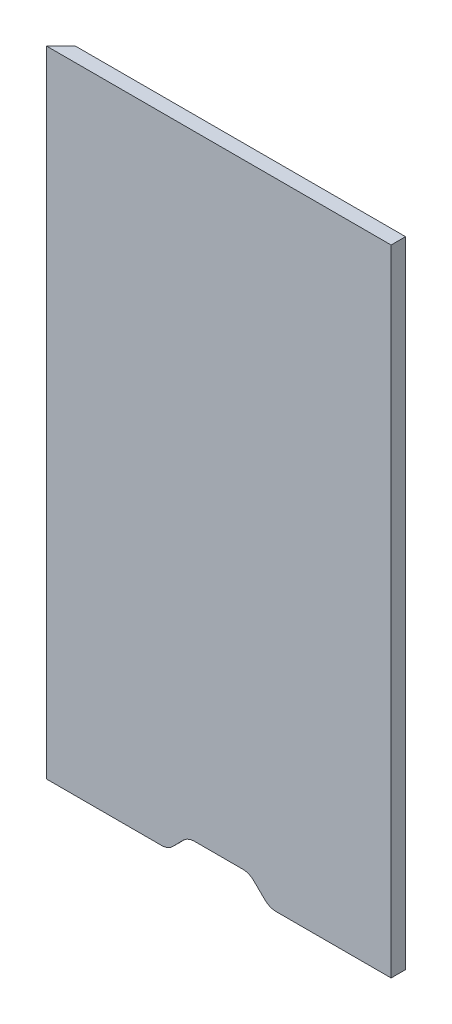
ISO-10303-21;
HEADER;
FILE_DESCRIPTION(('STEP AP214'),'2;1');
FILE_NAME('part.step','',(''),(''),'','','');
FILE_SCHEMA(('AUTOMOTIVE_DESIGN { 1 0 10303 214 1 1 1 1 }'));
ENDSEC;
DATA;
#1=APPLICATION_CONTEXT('core data for automotive mechanical design processes');
#2=APPLICATION_PROTOCOL_DEFINITION('international standard','automotive_design',2000,#1);
#3=PRODUCT_CONTEXT('',#1,'mechanical');
#4=PRODUCT('Part','Part','',(#3));
#5=PRODUCT_RELATED_PRODUCT_CATEGORY('part','',(#4));
#6=PRODUCT_DEFINITION_FORMATION('','',#4);
#7=PRODUCT_DEFINITION_CONTEXT('part definition',#1,'design');
#8=PRODUCT_DEFINITION('design','',#6,#7);
#9=PRODUCT_DEFINITION_SHAPE('','',#8);
#10=(LENGTH_UNIT() NAMED_UNIT(*) SI_UNIT(.MILLI.,.METRE.));
#11=(NAMED_UNIT(*) PLANE_ANGLE_UNIT() SI_UNIT($,.RADIAN.));
#12=(NAMED_UNIT(*) SI_UNIT($,.STERADIAN.) SOLID_ANGLE_UNIT());
#13=UNCERTAINTY_MEASURE_WITH_UNIT(LENGTH_MEASURE(1.E-05),#10,'distance_accuracy_value','');
#14=(GEOMETRIC_REPRESENTATION_CONTEXT(3) GLOBAL_UNCERTAINTY_ASSIGNED_CONTEXT((#13)) GLOBAL_UNIT_ASSIGNED_CONTEXT((#10,
#11,#12)) REPRESENTATION_CONTEXT('',''));
#15=CARTESIAN_POINT('',(0.,0.,0.));
#16=DIRECTION('',(0.,0.,1.));
#17=DIRECTION('',(1.,0.,0.));
#18=AXIS2_PLACEMENT_3D('',#15,#16,#17);
#19=CARTESIAN_POINT('',(0.,0.,18.));
#20=DIRECTION('',(0.707106781186547,0.,0.707106781186548));
#21=DIRECTION('',(0.,-1.,0.));
#22=AXIS2_PLACEMENT_3D('',#19,#20,#21);
#23=PLANE('',#22);
#24=DIRECTION('',(0.,-1.,0.));
#25=VECTOR('',#24,1.);
#26=CARTESIAN_POINT('',(0.,0.,18.));
#27=LINE('',#26,#25);
#28=CARTESIAN_POINT('',(0.,792.,18.));
#29=VERTEX_POINT('',#28);
#30=CARTESIAN_POINT('',(0.,0.,18.));
#31=VERTEX_POINT('',#30);
#32=EDGE_CURVE('E121',#29,#31,#27,.T.);
#33=ORIENTED_EDGE('',*,*,#32,.F.);
#34=DIRECTION('',(0.707106781186548,0.,-0.707106781186547));
#35=VECTOR('',#34,1.);
#36=CARTESIAN_POINT('',(0.,792.,18.));
#37=LINE('',#36,#35);
#38=CARTESIAN_POINT('',(18.,792.,0.));
#39=VERTEX_POINT('',#38);
#40=EDGE_CURVE('E45',#39,#29,#37,.F.);
#41=ORIENTED_EDGE('',*,*,#40,.F.);
#42=DIRECTION('',(0.,1.,0.));
#43=VECTOR('',#42,1.);
#44=CARTESIAN_POINT('',(18.,20.,0.));
#45=LINE('',#44,#43);
#46=CARTESIAN_POINT('',(18.,0.,0.));
#47=VERTEX_POINT('',#46);
#48=EDGE_CURVE('E122',#47,#39,#45,.T.);
#49=ORIENTED_EDGE('',*,*,#48,.F.);
#50=DIRECTION('',(-0.707106781186548,0.,0.707106781186547));
#51=VECTOR('',#50,1.);
#52=CARTESIAN_POINT('',(0.,0.,18.));
#53=LINE('',#52,#51);
#54=EDGE_CURVE('E13',#31,#47,#53,.F.);
#55=ORIENTED_EDGE('',*,*,#54,.F.);
#56=EDGE_LOOP('',(#33,#41,#49,#55));
#57=FACE_BOUND('',#56,.T.);
#58=ADVANCED_FACE('F38',(#57),#23,.F.);
#59=CARTESIAN_POINT('',(0.,0.,18.));
#60=DIRECTION('',(0.,1.,0.));
#61=DIRECTION('',(0.,0.,1.));
#62=AXIS2_PLACEMENT_3D('',#59,#60,#61);
#63=PLANE('',#62);
#64=DIRECTION('',(1.,0.,0.));
#65=VECTOR('',#64,1.);
#66=CARTESIAN_POINT('',(0.,0.,18.));
#67=LINE('',#66,#65);
#68=CARTESIAN_POINT('',(143.426172229615,0.,18.));
#69=VERTEX_POINT('',#68);
#70=EDGE_CURVE('E125',#31,#69,#67,.T.);
#71=ORIENTED_EDGE('',*,*,#70,.F.);
#72=ORIENTED_EDGE('',*,*,#54,.T.);
#73=DIRECTION('',(1.,0.,0.));
#74=VECTOR('',#73,1.);
#75=CARTESIAN_POINT('',(0.,0.,0.));
#76=LINE('',#75,#74);
#77=CARTESIAN_POINT('',(143.426172229615,0.,0.));
#78=VERTEX_POINT('',#77);
#79=EDGE_CURVE('E162',#47,#78,#76,.T.);
#80=ORIENTED_EDGE('',*,*,#79,.T.);
#81=DIRECTION('',(0.,0.,-1.));
#82=VECTOR('',#81,1.);
#83=CARTESIAN_POINT('',(143.426172229615,0.,18.));
#84=LINE('',#83,#82);
#85=EDGE_CURVE('E128',#69,#78,#84,.T.);
#86=ORIENTED_EDGE('',*,*,#85,.F.);
#87=EDGE_LOOP('',(#71,#72,#80,#86));
#88=FACE_BOUND('',#87,.T.);
#89=ADVANCED_FACE('F126',(#88),#63,.F.);
#90=CARTESIAN_POINT('',(143.426172229615,20.,18.));
#91=DIRECTION('',(0.,0.,-1.));
#92=DIRECTION('',(-1.,0.,0.));
#93=AXIS2_PLACEMENT_3D('',#90,#91,#92);
#94=CYLINDRICAL_SURFACE('',#93,20.);
#95=CARTESIAN_POINT('',(143.426172229615,20.,0.));
#96=DIRECTION('',(0.,0.,1.));
#97=DIRECTION('',(-1.,0.,0.));
#98=AXIS2_PLACEMENT_3D('',#95,#96,#97);
#99=CIRCLE('',#98,20.);
#100=CARTESIAN_POINT('',(157.706433265806,5.99735222401667,0.));
#101=VERTEX_POINT('',#100);
#102=EDGE_CURVE('E164',#78,#101,#99,.T.);
#103=ORIENTED_EDGE('',*,*,#102,.T.);
#104=DIRECTION('',(0.,0.,-1.));
#105=VECTOR('',#104,1.);
#106=CARTESIAN_POINT('',(157.706433265806,5.99735222401667,18.));
#107=LINE('',#106,#105);
#108=CARTESIAN_POINT('',(157.706433265806,5.99735222401667,18.));
#109=VERTEX_POINT('',#108);
#110=EDGE_CURVE('E204',#109,#101,#107,.T.);
#111=ORIENTED_EDGE('',*,*,#110,.F.);
#112=CARTESIAN_POINT('',(143.426172229615,20.,18.));
#113=DIRECTION('',(0.,0.,1.));
#114=DIRECTION('',(-1.,0.,0.));
#115=AXIS2_PLACEMENT_3D('',#112,#113,#114);
#116=CIRCLE('',#115,20.);
#117=EDGE_CURVE('E131',#69,#109,#116,.T.);
#118=ORIENTED_EDGE('',*,*,#117,.F.);
#119=ORIENTED_EDGE('',*,*,#85,.T.);
#120=EDGE_LOOP('',(#103,#111,#118,#119));
#121=FACE_BOUND('',#120,.T.);
#122=ADVANCED_FACE('F219',(#121),#94,.T.);
#123=CARTESIAN_POINT('',(157.706433265806,5.99735222401667,18.));
#124=DIRECTION('',(-0.714013051809539,0.700132388799167,0.));
#125=DIRECTION('',(-0.700132388799167,-0.714013051809539,0.));
#126=AXIS2_PLACEMENT_3D('',#123,#124,#125);
#127=PLANE('',#126);
#128=DIRECTION('',(0.700132388799167,0.714013051809539,0.));
#129=VECTOR('',#128,1.);
#130=CARTESIAN_POINT('',(157.706433265806,5.99735222401667,0.));
#131=LINE('',#130,#129);
#132=CARTESIAN_POINT('',(170.458901331707,19.0026477759833,0.));
#133=VERTEX_POINT('',#132);
#134=EDGE_CURVE('E166',#101,#133,#131,.T.);
#135=ORIENTED_EDGE('',*,*,#134,.T.);
#136=DIRECTION('',(0.,0.,-1.));
#137=VECTOR('',#136,1.);
#138=CARTESIAN_POINT('',(170.458901331707,19.0026477759833,18.));
#139=LINE('',#138,#137);
#140=CARTESIAN_POINT('',(170.458901331707,19.0026477759833,18.));
#141=VERTEX_POINT('',#140);
#142=EDGE_CURVE('E201',#141,#133,#139,.T.);
#143=ORIENTED_EDGE('',*,*,#142,.F.);
#144=DIRECTION('',(0.700132388799167,0.714013051809539,0.));
#145=VECTOR('',#144,1.);
#146=CARTESIAN_POINT('',(157.706433265806,5.99735222401667,18.));
#147=LINE('',#146,#145);
#148=EDGE_CURVE('E144',#109,#141,#147,.T.);
#149=ORIENTED_EDGE('',*,*,#148,.F.);
#150=ORIENTED_EDGE('',*,*,#110,.T.);
#151=EDGE_LOOP('',(#135,#143,#149,#150));
#152=FACE_BOUND('',#151,.T.);
#153=ADVANCED_FACE('F226',(#152),#127,.F.);
#154=CARTESIAN_POINT('',(184.739162367898,5.,18.));
#155=DIRECTION('',(0.,0.,-1.));
#156=DIRECTION('',(-1.,0.,0.));
#157=AXIS2_PLACEMENT_3D('',#154,#155,#156);
#158=CYLINDRICAL_SURFACE('',#157,20.);
#159=CARTESIAN_POINT('',(184.739162367898,5.,0.));
#160=DIRECTION('',(0.,0.,-1.));
#161=DIRECTION('',(-1.,0.,0.));
#162=AXIS2_PLACEMENT_3D('',#159,#160,#161);
#163=CIRCLE('',#162,20.);
#164=CARTESIAN_POINT('',(184.739162367898,25.,0.));
#165=VERTEX_POINT('',#164);
#166=EDGE_CURVE('E168',#133,#165,#163,.T.);
#167=ORIENTED_EDGE('',*,*,#166,.T.);
#168=DIRECTION('',(0.,0.,-1.));
#169=VECTOR('',#168,1.);
#170=CARTESIAN_POINT('',(184.739162367898,25.,18.));
#171=LINE('',#170,#169);
#172=CARTESIAN_POINT('',(184.739162367898,25.,18.));
#173=VERTEX_POINT('',#172);
#174=EDGE_CURVE('E198',#173,#165,#171,.T.);
#175=ORIENTED_EDGE('',*,*,#174,.F.);
#176=CARTESIAN_POINT('',(184.739162367898,5.,18.));
#177=DIRECTION('',(0.,0.,-1.));
#178=DIRECTION('',(-1.,0.,0.));
#179=AXIS2_PLACEMENT_3D('',#176,#177,#178);
#180=CIRCLE('',#179,20.);
#181=EDGE_CURVE('E146',#141,#173,#180,.T.);
#182=ORIENTED_EDGE('',*,*,#181,.F.);
#183=ORIENTED_EDGE('',*,*,#142,.T.);
#184=EDGE_LOOP('',(#167,#175,#182,#183));
#185=FACE_BOUND('',#184,.T.);
#186=ADVANCED_FACE('F229',(#185),#158,.F.);
#187=CARTESIAN_POINT('',(184.739162367898,25.,18.));
#188=DIRECTION('',(0.,1.,0.));
#189=DIRECTION('',(-1.,0.,0.));
#190=AXIS2_PLACEMENT_3D('',#187,#188,#189);
#191=PLANE('',#190);
#192=DIRECTION('',(1.,0.,0.));
#193=VECTOR('',#192,1.);
#194=CARTESIAN_POINT('',(184.739162367898,25.,0.));
#195=LINE('',#194,#193);
#196=CARTESIAN_POINT('',(244.739162367898,25.,0.));
#197=VERTEX_POINT('',#196);
#198=EDGE_CURVE('E170',#165,#197,#195,.T.);
#199=ORIENTED_EDGE('',*,*,#198,.T.);
#200=DIRECTION('',(0.,0.,-1.));
#201=VECTOR('',#200,1.);
#202=CARTESIAN_POINT('',(244.739162367898,25.,18.));
#203=LINE('',#202,#201);
#204=CARTESIAN_POINT('',(244.739162367898,25.,18.));
#205=VERTEX_POINT('',#204);
#206=EDGE_CURVE('E195',#205,#197,#203,.T.);
#207=ORIENTED_EDGE('',*,*,#206,.F.);
#208=DIRECTION('',(1.,0.,0.));
#209=VECTOR('',#208,1.);
#210=CARTESIAN_POINT('',(184.739162367898,25.,18.));
#211=LINE('',#210,#209);
#212=EDGE_CURVE('E148',#173,#205,#211,.T.);
#213=ORIENTED_EDGE('',*,*,#212,.F.);
#214=ORIENTED_EDGE('',*,*,#174,.T.);
#215=EDGE_LOOP('',(#199,#207,#213,#214));
#216=FACE_BOUND('',#215,.T.);
#217=ADVANCED_FACE('F234',(#216),#191,.F.);
#218=CARTESIAN_POINT('',(244.739162367898,5.,18.));
#219=DIRECTION('',(0.,0.,-1.));
#220=DIRECTION('',(-1.,0.,0.));
#221=AXIS2_PLACEMENT_3D('',#218,#219,#220);
#222=CYLINDRICAL_SURFACE('',#221,20.);
#223=CARTESIAN_POINT('',(244.739162367898,5.,0.));
#224=DIRECTION('',(0.,0.,-1.));
#225=DIRECTION('',(-1.,0.,0.));
#226=AXIS2_PLACEMENT_3D('',#223,#224,#225);
#227=CIRCLE('',#226,20.);
#228=CARTESIAN_POINT('',(258.741810143881,19.2802610361908,0.));
#229=VERTEX_POINT('',#228);
#230=EDGE_CURVE('E172',#197,#229,#227,.T.);
#231=ORIENTED_EDGE('',*,*,#230,.T.);
#232=DIRECTION('',(0.,0.,-1.));
#233=VECTOR('',#232,1.);
#234=CARTESIAN_POINT('',(258.741810143881,19.2802610361908,18.));
#235=LINE('',#234,#233);
#236=CARTESIAN_POINT('',(258.741810143881,19.2802610361908,18.));
#237=VERTEX_POINT('',#236);
#238=EDGE_CURVE('E192',#237,#229,#235,.T.);
#239=ORIENTED_EDGE('',*,*,#238,.F.);
#240=CARTESIAN_POINT('',(244.739162367898,5.,18.));
#241=DIRECTION('',(0.,0.,-1.));
#242=DIRECTION('',(-1.,0.,0.));
#243=AXIS2_PLACEMENT_3D('',#240,#241,#242);
#244=CIRCLE('',#243,20.);
#245=EDGE_CURVE('E150',#205,#237,#244,.T.);
#246=ORIENTED_EDGE('',*,*,#245,.F.);
#247=ORIENTED_EDGE('',*,*,#206,.T.);
#248=EDGE_LOOP('',(#231,#239,#246,#247));
#249=FACE_BOUND('',#248,.T.);
#250=ADVANCED_FACE('F240',(#249),#222,.F.);
#251=CARTESIAN_POINT('',(258.741810143881,19.2802610361908,18.));
#252=DIRECTION('',(0.700132388799166,0.71401305180954,0.));
#253=DIRECTION('',(-0.71401305180954,0.700132388799166,0.));
#254=AXIS2_PLACEMENT_3D('',#251,#252,#253);
#255=PLANE('',#254);
#256=DIRECTION('',(0.71401305180954,-0.700132388799166,0.));
#257=VECTOR('',#256,1.);
#258=CARTESIAN_POINT('',(258.741810143881,19.2802610361908,0.));
#259=LINE('',#258,#257);
#260=CARTESIAN_POINT('',(272.571179994401,5.71973896380918,0.));
#261=VERTEX_POINT('',#260);
#262=EDGE_CURVE('E174',#229,#261,#259,.T.);
#263=ORIENTED_EDGE('',*,*,#262,.T.);
#264=DIRECTION('',(0.,0.,-1.));
#265=VECTOR('',#264,1.);
#266=CARTESIAN_POINT('',(272.571179994401,5.71973896380918,18.));
#267=LINE('',#266,#265);
#268=CARTESIAN_POINT('',(272.571179994401,5.71973896380918,18.));
#269=VERTEX_POINT('',#268);
#270=EDGE_CURVE('E189',#269,#261,#267,.T.);
#271=ORIENTED_EDGE('',*,*,#270,.F.);
#272=DIRECTION('',(0.71401305180954,-0.700132388799166,0.));
#273=VECTOR('',#272,1.);
#274=CARTESIAN_POINT('',(258.741810143881,19.2802610361908,18.));
#275=LINE('',#274,#273);
#276=EDGE_CURVE('E152',#237,#269,#275,.T.);
#277=ORIENTED_EDGE('',*,*,#276,.F.);
#278=ORIENTED_EDGE('',*,*,#238,.T.);
#279=EDGE_LOOP('',(#263,#271,#277,#278));
#280=FACE_BOUND('',#279,.T.);
#281=ADVANCED_FACE('F244',(#280),#255,.F.);
#282=CARTESIAN_POINT('',(286.573827770385,20.,18.));
#283=DIRECTION('',(0.,0.,-1.));
#284=DIRECTION('',(-1.,0.,0.));
#285=AXIS2_PLACEMENT_3D('',#282,#283,#284);
#286=CYLINDRICAL_SURFACE('',#285,20.);
#287=CARTESIAN_POINT('',(286.573827770385,20.,0.));
#288=DIRECTION('',(0.,0.,1.));
#289=DIRECTION('',(1.,0.,0.));
#290=AXIS2_PLACEMENT_3D('',#287,#288,#289);
#291=CIRCLE('',#290,20.);
#292=CARTESIAN_POINT('',(286.573827770385,0.,0.));
#293=VERTEX_POINT('',#292);
#294=EDGE_CURVE('E176',#261,#293,#291,.T.);
#295=ORIENTED_EDGE('',*,*,#294,.T.);
#296=DIRECTION('',(0.,0.,-1.));
#297=VECTOR('',#296,1.);
#298=CARTESIAN_POINT('',(286.573827770385,0.,18.));
#299=LINE('',#298,#297);
#300=CARTESIAN_POINT('',(286.573827770385,0.,18.));
#301=VERTEX_POINT('',#300);
#302=EDGE_CURVE('E186',#301,#293,#299,.T.);
#303=ORIENTED_EDGE('',*,*,#302,.F.);
#304=CARTESIAN_POINT('',(286.573827770385,20.,18.));
#305=DIRECTION('',(0.,0.,1.));
#306=DIRECTION('',(1.,0.,0.));
#307=AXIS2_PLACEMENT_3D('',#304,#305,#306);
#308=CIRCLE('',#307,20.);
#309=EDGE_CURVE('E154',#269,#301,#308,.T.);
#310=ORIENTED_EDGE('',*,*,#309,.F.);
#311=ORIENTED_EDGE('',*,*,#270,.T.);
#312=EDGE_LOOP('',(#295,#303,#310,#311));
#313=FACE_BOUND('',#312,.T.);
#314=ADVANCED_FACE('F249',(#313),#286,.T.);
#315=CARTESIAN_POINT('',(286.573827770385,0.,18.));
#316=DIRECTION('',(0.,1.,0.));
#317=DIRECTION('',(0.,0.,1.));
#318=AXIS2_PLACEMENT_3D('',#315,#316,#317);
#319=PLANE('',#318);
#320=DIRECTION('',(1.,0.,0.));
#321=VECTOR('',#320,1.);
#322=CARTESIAN_POINT('',(286.573827770385,0.,0.));
#323=LINE('',#322,#321);
#324=CARTESIAN_POINT('',(430.,0.,0.));
#325=VERTEX_POINT('',#324);
#326=EDGE_CURVE('E178',#293,#325,#323,.T.);
#327=ORIENTED_EDGE('',*,*,#326,.T.);
#328=DIRECTION('',(0.,0.,-1.));
#329=VECTOR('',#328,1.);
#330=CARTESIAN_POINT('',(430.,0.,18.));
#331=LINE('',#330,#329);
#332=CARTESIAN_POINT('',(430.,0.,18.));
#333=VERTEX_POINT('',#332);
#334=EDGE_CURVE('E183',#333,#325,#331,.T.);
#335=ORIENTED_EDGE('',*,*,#334,.F.);
#336=DIRECTION('',(1.,0.,0.));
#337=VECTOR('',#336,1.);
#338=CARTESIAN_POINT('',(286.573827770385,0.,18.));
#339=LINE('',#338,#337);
#340=EDGE_CURVE('E156',#301,#333,#339,.T.);
#341=ORIENTED_EDGE('',*,*,#340,.F.);
#342=ORIENTED_EDGE('',*,*,#302,.T.);
#343=EDGE_LOOP('',(#327,#335,#341,#342));
#344=FACE_BOUND('',#343,.T.);
#345=ADVANCED_FACE('F254',(#344),#319,.F.);
#346=CARTESIAN_POINT('',(430.,0.,18.));
#347=DIRECTION('',(-1.,0.,0.));
#348=DIRECTION('',(0.,0.,1.));
#349=AXIS2_PLACEMENT_3D('',#346,#347,#348);
#350=PLANE('',#349);
#351=DIRECTION('',(0.,1.,0.));
#352=VECTOR('',#351,1.);
#353=CARTESIAN_POINT('',(430.,0.,0.));
#354=LINE('',#353,#352);
#355=CARTESIAN_POINT('',(430.,792.,0.));
#356=VERTEX_POINT('',#355);
#357=EDGE_CURVE('E140',#325,#356,#354,.T.);
#358=ORIENTED_EDGE('',*,*,#357,.T.);
#359=DIRECTION('',(0.,0.,-1.));
#360=VECTOR('',#359,1.);
#361=CARTESIAN_POINT('',(430.,792.,18.));
#362=LINE('',#361,#360);
#363=CARTESIAN_POINT('',(430.,792.,18.));
#364=VERTEX_POINT('',#363);
#365=EDGE_CURVE('E161',#364,#356,#362,.T.);
#366=ORIENTED_EDGE('',*,*,#365,.F.);
#367=DIRECTION('',(0.,1.,0.));
#368=VECTOR('',#367,1.);
#369=CARTESIAN_POINT('',(430.,0.,18.));
#370=LINE('',#369,#368);
#371=EDGE_CURVE('E158',#333,#364,#370,.T.);
#372=ORIENTED_EDGE('',*,*,#371,.F.);
#373=ORIENTED_EDGE('',*,*,#334,.T.);
#374=EDGE_LOOP('',(#358,#366,#372,#373));
#375=FACE_BOUND('',#374,.T.);
#376=ADVANCED_FACE('F256',(#375),#350,.F.);
#377=CARTESIAN_POINT('',(0.,792.,18.));
#378=DIRECTION('',(0.,-1.,0.));
#379=DIRECTION('',(0.,0.,-1.));
#380=AXIS2_PLACEMENT_3D('',#377,#378,#379);
#381=PLANE('',#380);
#382=DIRECTION('',(-1.,0.,0.));
#383=VECTOR('',#382,1.);
#384=CARTESIAN_POINT('',(0.,792.,0.));
#385=LINE('',#384,#383);
#386=EDGE_CURVE('E137',#356,#39,#385,.T.);
#387=ORIENTED_EDGE('',*,*,#386,.T.);
#388=ORIENTED_EDGE('',*,*,#40,.T.);
#389=DIRECTION('',(-1.,0.,0.));
#390=VECTOR('',#389,1.);
#391=CARTESIAN_POINT('',(0.,792.,18.));
#392=LINE('',#391,#390);
#393=EDGE_CURVE('E136',#364,#29,#392,.T.);
#394=ORIENTED_EDGE('',*,*,#393,.F.);
#395=ORIENTED_EDGE('',*,*,#365,.T.);
#396=EDGE_LOOP('',(#387,#388,#394,#395));
#397=FACE_BOUND('',#396,.T.);
#398=ADVANCED_FACE('F209',(#397),#381,.F.);
#399=CARTESIAN_POINT('',(286.573827770385,20.,18.));
#400=DIRECTION('',(0.,0.,1.));
#401=DIRECTION('',(1.,0.,0.));
#402=AXIS2_PLACEMENT_3D('',#399,#400,#401);
#403=PLANE('',#402);
#404=ORIENTED_EDGE('',*,*,#32,.T.);
#405=ORIENTED_EDGE('',*,*,#70,.T.);
#406=ORIENTED_EDGE('',*,*,#117,.T.);
#407=ORIENTED_EDGE('',*,*,#148,.T.);
#408=ORIENTED_EDGE('',*,*,#181,.T.);
#409=ORIENTED_EDGE('',*,*,#212,.T.);
#410=ORIENTED_EDGE('',*,*,#245,.T.);
#411=ORIENTED_EDGE('',*,*,#276,.T.);
#412=ORIENTED_EDGE('',*,*,#309,.T.);
#413=ORIENTED_EDGE('',*,*,#340,.T.);
#414=ORIENTED_EDGE('',*,*,#371,.T.);
#415=ORIENTED_EDGE('',*,*,#393,.T.);
#416=EDGE_LOOP('',(#404,#405,#406,#407,#408,#409,#410,#411,#412,#413,#414,#415));
#417=FACE_BOUND('',#416,.T.);
#418=ADVANCED_FACE('F134',(#417),#403,.T.);
#419=CARTESIAN_POINT('',(286.573827770385,20.,0.));
#420=DIRECTION('',(0.,0.,1.));
#421=DIRECTION('',(1.,0.,0.));
#422=AXIS2_PLACEMENT_3D('',#419,#420,#421);
#423=PLANE('',#422);
#424=ORIENTED_EDGE('',*,*,#79,.F.);
#425=ORIENTED_EDGE('',*,*,#48,.T.);
#426=ORIENTED_EDGE('',*,*,#386,.F.);
#427=ORIENTED_EDGE('',*,*,#357,.F.);
#428=ORIENTED_EDGE('',*,*,#326,.F.);
#429=ORIENTED_EDGE('',*,*,#294,.F.);
#430=ORIENTED_EDGE('',*,*,#262,.F.);
#431=ORIENTED_EDGE('',*,*,#230,.F.);
#432=ORIENTED_EDGE('',*,*,#198,.F.);
#433=ORIENTED_EDGE('',*,*,#166,.F.);
#434=ORIENTED_EDGE('',*,*,#134,.F.);
#435=ORIENTED_EDGE('',*,*,#102,.F.);
#436=EDGE_LOOP('',(#424,#425,#426,#427,#428,#429,#430,#431,#432,#433,#434,#435));
#437=FACE_BOUND('',#436,.T.);
#438=ADVANCED_FACE('F214',(#437),#423,.F.);
#439=CLOSED_SHELL('',(#58,#89,#122,#153,#186,#217,#250,#281,#314,#345,#376,#398,#418,#438));
#440=MANIFOLD_SOLID_BREP('B2',#439);
#441=ADVANCED_BREP_SHAPE_REPRESENTATION('',(#18,#440),#14);
#442=SHAPE_DEFINITION_REPRESENTATION(#9,#441);
ENDSEC;
END-ISO-10303-21;
